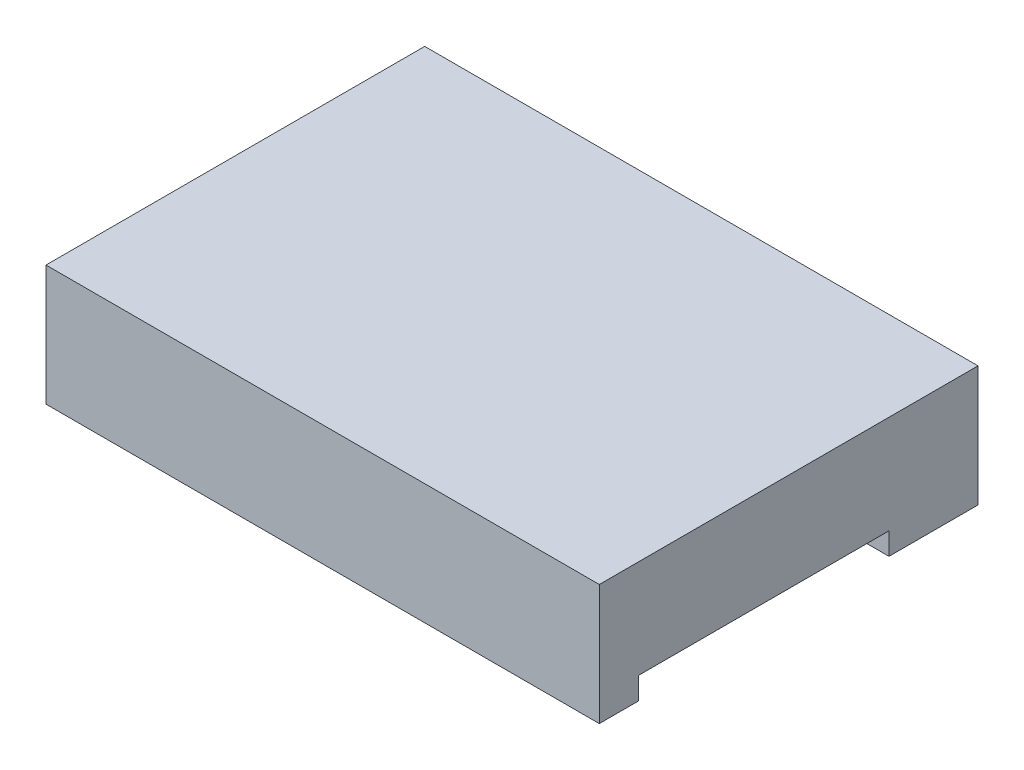
ISO-10303-21;
HEADER;
FILE_DESCRIPTION(('STEP AP214'),'2;1');
FILE_NAME('part.step','',(''),(''),'','','');
FILE_SCHEMA(('AUTOMOTIVE_DESIGN { 1 0 10303 214 1 1 1 1 }'));
ENDSEC;
DATA;
#1=APPLICATION_CONTEXT('core data for automotive mechanical design processes');
#2=APPLICATION_PROTOCOL_DEFINITION('international standard','automotive_design',2000,#1);
#3=PRODUCT_CONTEXT('',#1,'mechanical');
#4=PRODUCT('Part','Part','',(#3));
#5=PRODUCT_RELATED_PRODUCT_CATEGORY('part','',(#4));
#6=PRODUCT_DEFINITION_FORMATION('','',#4);
#7=PRODUCT_DEFINITION_CONTEXT('part definition',#1,'design');
#8=PRODUCT_DEFINITION('design','',#6,#7);
#9=PRODUCT_DEFINITION_SHAPE('','',#8);
#10=(LENGTH_UNIT() NAMED_UNIT(*) SI_UNIT(.MILLI.,.METRE.));
#11=(NAMED_UNIT(*) PLANE_ANGLE_UNIT() SI_UNIT($,.RADIAN.));
#12=(NAMED_UNIT(*) SI_UNIT($,.STERADIAN.) SOLID_ANGLE_UNIT());
#13=UNCERTAINTY_MEASURE_WITH_UNIT(LENGTH_MEASURE(1.E-05),#10,'distance_accuracy_value','');
#14=(GEOMETRIC_REPRESENTATION_CONTEXT(3) GLOBAL_UNCERTAINTY_ASSIGNED_CONTEXT((#13)) GLOBAL_UNIT_ASSIGNED_CONTEXT((#10,
#11,#12)) REPRESENTATION_CONTEXT('',''));
#15=CARTESIAN_POINT('',(0.,0.,0.));
#16=DIRECTION('',(0.,0.,1.));
#17=DIRECTION('',(1.,0.,0.));
#18=AXIS2_PLACEMENT_3D('',#15,#16,#17);
#19=CARTESIAN_POINT('',(0.,1.5,0.));
#20=DIRECTION('',(0.,-1.,0.));
#21=DIRECTION('',(0.,0.,-1.));
#22=AXIS2_PLACEMENT_3D('',#19,#20,#21);
#23=PLANE('',#22);
#24=DIRECTION('',(0.,0.,-1.));
#25=VECTOR('',#24,1.);
#26=CARTESIAN_POINT('',(43.5,1.5,30.5));
#27=LINE('',#26,#25);
#28=CARTESIAN_POINT('',(43.5,1.5,38.5));
#29=VERTEX_POINT('',#28);
#30=CARTESIAN_POINT('',(43.5,1.5,30.5));
#31=VERTEX_POINT('',#30);
#32=EDGE_CURVE('E124',#29,#31,#27,.T.);
#33=ORIENTED_EDGE('',*,*,#32,.F.);
#34=DIRECTION('',(1.,0.,0.));
#35=VECTOR('',#34,1.);
#36=CARTESIAN_POINT('',(41.5,1.5,38.5));
#37=LINE('',#36,#35);
#38=CARTESIAN_POINT('',(-69.,1.5,38.5));
#39=VERTEX_POINT('',#38);
#40=EDGE_CURVE('E11',#39,#29,#37,.T.);
#41=ORIENTED_EDGE('',*,*,#40,.F.);
#42=DIRECTION('',(0.,0.,1.));
#43=VECTOR('',#42,1.);
#44=CARTESIAN_POINT('',(-69.,1.5,38.5));
#45=LINE('',#44,#43);
#46=CARTESIAN_POINT('',(-69.,1.5,-38.5));
#47=VERTEX_POINT('',#46);
#48=EDGE_CURVE('E40',#47,#39,#45,.T.);
#49=ORIENTED_EDGE('',*,*,#48,.F.);
#50=DIRECTION('',(-1.,0.,0.));
#51=VECTOR('',#50,1.);
#52=CARTESIAN_POINT('',(41.5,1.5,-38.5));
#53=LINE('',#52,#51);
#54=CARTESIAN_POINT('',(43.5,1.5,-38.5));
#55=VERTEX_POINT('',#54);
#56=EDGE_CURVE('E54',#55,#47,#53,.T.);
#57=ORIENTED_EDGE('',*,*,#56,.F.);
#58=DIRECTION('',(0.,0.,-1.));
#59=VECTOR('',#58,1.);
#60=CARTESIAN_POINT('',(43.5,1.5,-38.5));
#61=LINE('',#60,#59);
#62=CARTESIAN_POINT('',(43.5,1.5,-20.4));
#63=VERTEX_POINT('',#62);
#64=EDGE_CURVE('E132',#63,#55,#61,.T.);
#65=ORIENTED_EDGE('',*,*,#64,.F.);
#66=DIRECTION('',(1.,0.,0.));
#67=VECTOR('',#66,1.);
#68=CARTESIAN_POINT('',(43.5,1.5,-20.4));
#69=LINE('',#68,#67);
#70=CARTESIAN_POINT('',(-44.,1.5,-20.4));
#71=VERTEX_POINT('',#70);
#72=EDGE_CURVE('E129',#71,#63,#69,.T.);
#73=ORIENTED_EDGE('',*,*,#72,.F.);
#74=DIRECTION('',(0.,0.,-1.));
#75=VECTOR('',#74,1.);
#76=CARTESIAN_POINT('',(-44.,1.5,-20.4));
#77=LINE('',#76,#75);
#78=CARTESIAN_POINT('',(-44.,1.5,30.5));
#79=VERTEX_POINT('',#78);
#80=EDGE_CURVE('E173',#79,#71,#77,.T.);
#81=ORIENTED_EDGE('',*,*,#80,.F.);
#82=DIRECTION('',(-1.,0.,0.));
#83=VECTOR('',#82,1.);
#84=CARTESIAN_POINT('',(-44.,1.5,30.5));
#85=LINE('',#84,#83);
#86=EDGE_CURVE('E146',#31,#79,#85,.T.);
#87=ORIENTED_EDGE('',*,*,#86,.F.);
#88=EDGE_LOOP('',(#33,#41,#49,#57,#65,#73,#81,#87));
#89=FACE_BOUND('',#88,.T.);
#90=ADVANCED_FACE('F32',(#89),#23,.T.);
#91=CARTESIAN_POINT('',(-69.,-20.,38.5));
#92=DIRECTION('',(1.,0.,0.));
#93=DIRECTION('',(0.,0.,-1.));
#94=AXIS2_PLACEMENT_3D('',#91,#92,#93);
#95=PLANE('',#94);
#96=DIRECTION('',(0.,1.,0.));
#97=VECTOR('',#96,1.);
#98=CARTESIAN_POINT('',(-69.,-20.,-38.5));
#99=LINE('',#98,#97);
#100=CARTESIAN_POINT('',(-69.,26.,-38.5));
#101=VERTEX_POINT('',#100);
#102=EDGE_CURVE('E102',#47,#101,#99,.T.);
#103=ORIENTED_EDGE('',*,*,#102,.F.);
#104=ORIENTED_EDGE('',*,*,#48,.T.);
#105=DIRECTION('',(0.,1.,0.));
#106=VECTOR('',#105,1.);
#107=CARTESIAN_POINT('',(-69.,-20.,38.5));
#108=LINE('',#107,#106);
#109=CARTESIAN_POINT('',(-69.,26.,38.5));
#110=VERTEX_POINT('',#109);
#111=EDGE_CURVE('E96',#39,#110,#108,.T.);
#112=ORIENTED_EDGE('',*,*,#111,.T.);
#113=DIRECTION('',(0.,0.,1.));
#114=VECTOR('',#113,1.);
#115=CARTESIAN_POINT('',(-69.,26.,-38.5));
#116=LINE('',#115,#114);
#117=EDGE_CURVE('E100',#101,#110,#116,.T.);
#118=ORIENTED_EDGE('',*,*,#117,.F.);
#119=EDGE_LOOP('',(#103,#104,#112,#118));
#120=FACE_BOUND('',#119,.T.);
#121=ADVANCED_FACE('F98',(#120),#95,.F.);
#122=CARTESIAN_POINT('',(0.,26.,0.));
#123=DIRECTION('',(0.,1.,0.));
#124=DIRECTION('',(0.,0.,1.));
#125=AXIS2_PLACEMENT_3D('',#122,#123,#124);
#126=PLANE('',#125);
#127=ORIENTED_EDGE('',*,*,#117,.T.);
#128=DIRECTION('',(1.,0.,0.));
#129=VECTOR('',#128,1.);
#130=CARTESIAN_POINT('',(-69.,26.,38.5));
#131=LINE('',#130,#129);
#132=CARTESIAN_POINT('',(43.5,26.,38.5));
#133=VERTEX_POINT('',#132);
#134=EDGE_CURVE('E105',#110,#133,#131,.T.);
#135=ORIENTED_EDGE('',*,*,#134,.T.);
#136=DIRECTION('',(0.,0.,-1.));
#137=VECTOR('',#136,1.);
#138=CARTESIAN_POINT('',(43.5,26.,-38.5));
#139=LINE('',#138,#137);
#140=CARTESIAN_POINT('',(43.5,26.,-38.5));
#141=VERTEX_POINT('',#140);
#142=EDGE_CURVE('E111',#133,#141,#139,.T.);
#143=ORIENTED_EDGE('',*,*,#142,.T.);
#144=DIRECTION('',(-1.,0.,0.));
#145=VECTOR('',#144,1.);
#146=CARTESIAN_POINT('',(-69.,26.,-38.5));
#147=LINE('',#146,#145);
#148=EDGE_CURVE('E116',#141,#101,#147,.T.);
#149=ORIENTED_EDGE('',*,*,#148,.T.);
#150=EDGE_LOOP('',(#127,#135,#143,#149));
#151=FACE_BOUND('',#150,.T.);
#152=ADVANCED_FACE('F114',(#151),#126,.T.);
#153=CARTESIAN_POINT('',(41.5,-20.,-38.5));
#154=DIRECTION('',(0.,0.,1.));
#155=DIRECTION('',(1.,0.,0.));
#156=AXIS2_PLACEMENT_3D('',#153,#154,#155);
#157=PLANE('',#156);
#158=DIRECTION('',(0.,1.,0.));
#159=VECTOR('',#158,1.);
#160=CARTESIAN_POINT('',(43.5,-20.,-38.5));
#161=LINE('',#160,#159);
#162=EDGE_CURVE('E185',#55,#141,#161,.T.);
#163=ORIENTED_EDGE('',*,*,#162,.F.);
#164=ORIENTED_EDGE('',*,*,#56,.T.);
#165=ORIENTED_EDGE('',*,*,#102,.T.);
#166=ORIENTED_EDGE('',*,*,#148,.F.);
#167=EDGE_LOOP('',(#163,#164,#165,#166));
#168=FACE_BOUND('',#167,.T.);
#169=ADVANCED_FACE('F215',(#168),#157,.F.);
#170=CARTESIAN_POINT('',(41.5,-20.,38.5));
#171=DIRECTION('',(0.,0.,-1.));
#172=DIRECTION('',(-1.,0.,0.));
#173=AXIS2_PLACEMENT_3D('',#170,#171,#172);
#174=PLANE('',#173);
#175=ORIENTED_EDGE('',*,*,#111,.F.);
#176=ORIENTED_EDGE('',*,*,#40,.T.);
#177=DIRECTION('',(0.,1.,0.));
#178=VECTOR('',#177,1.);
#179=CARTESIAN_POINT('',(43.5,-20.,38.5));
#180=LINE('',#179,#178);
#181=EDGE_CURVE('E107',#29,#133,#180,.T.);
#182=ORIENTED_EDGE('',*,*,#181,.T.);
#183=ORIENTED_EDGE('',*,*,#134,.F.);
#184=EDGE_LOOP('',(#175,#176,#182,#183));
#185=FACE_BOUND('',#184,.T.);
#186=ADVANCED_FACE('F34',(#185),#174,.F.);
#187=CARTESIAN_POINT('',(43.5,144.327730121205,-20.4));
#188=DIRECTION('',(0.,0.,-1.));
#189=DIRECTION('',(-1.,0.,0.));
#190=AXIS2_PLACEMENT_3D('',#187,#188,#189);
#191=PLANE('',#190);
#192=DIRECTION('',(1.,0.,0.));
#193=VECTOR('',#192,1.);
#194=CARTESIAN_POINT('',(43.5,6.00000000000001,-20.4));
#195=LINE('',#194,#193);
#196=CARTESIAN_POINT('',(-44.,6.00000000000001,-20.4));
#197=VERTEX_POINT('',#196);
#198=CARTESIAN_POINT('',(43.5,6.,-20.4));
#199=VERTEX_POINT('',#198);
#200=EDGE_CURVE('E151',#197,#199,#195,.T.);
#201=ORIENTED_EDGE('',*,*,#200,.F.);
#202=DIRECTION('',(0.,-1.,0.));
#203=VECTOR('',#202,1.);
#204=CARTESIAN_POINT('',(-44.,144.327730121205,-20.4));
#205=LINE('',#204,#203);
#206=EDGE_CURVE('E137',#197,#71,#205,.T.);
#207=ORIENTED_EDGE('',*,*,#206,.T.);
#208=ORIENTED_EDGE('',*,*,#72,.T.);
#209=DIRECTION('',(0.,-1.,0.));
#210=VECTOR('',#209,1.);
#211=CARTESIAN_POINT('',(43.5,144.327730121205,-20.4));
#212=LINE('',#211,#210);
#213=EDGE_CURVE('E136',#199,#63,#212,.T.);
#214=ORIENTED_EDGE('',*,*,#213,.F.);
#215=EDGE_LOOP('',(#201,#207,#208,#214));
#216=FACE_BOUND('',#215,.T.);
#217=ADVANCED_FACE('F181',(#216),#191,.F.);
#218=CARTESIAN_POINT('',(-44.,144.327730121205,-20.4));
#219=DIRECTION('',(-1.,0.,0.));
#220=DIRECTION('',(0.,0.,1.));
#221=AXIS2_PLACEMENT_3D('',#218,#219,#220);
#222=PLANE('',#221);
#223=DIRECTION('',(0.,0.,-1.));
#224=VECTOR('',#223,1.);
#225=CARTESIAN_POINT('',(-44.,6.00000000000001,-20.4));
#226=LINE('',#225,#224);
#227=CARTESIAN_POINT('',(-44.,6.00000000000001,30.5));
#228=VERTEX_POINT('',#227);
#229=EDGE_CURVE('E149',#228,#197,#226,.T.);
#230=ORIENTED_EDGE('',*,*,#229,.F.);
#231=DIRECTION('',(0.,-1.,0.));
#232=VECTOR('',#231,1.);
#233=CARTESIAN_POINT('',(-44.,144.327730121205,30.5));
#234=LINE('',#233,#232);
#235=EDGE_CURVE('E170',#228,#79,#234,.T.);
#236=ORIENTED_EDGE('',*,*,#235,.T.);
#237=ORIENTED_EDGE('',*,*,#80,.T.);
#238=ORIENTED_EDGE('',*,*,#206,.F.);
#239=EDGE_LOOP('',(#230,#236,#237,#238));
#240=FACE_BOUND('',#239,.T.);
#241=ADVANCED_FACE('F190',(#240),#222,.F.);
#242=CARTESIAN_POINT('',(43.5,-20.,-38.5));
#243=DIRECTION('',(-1.,0.,0.));
#244=DIRECTION('',(0.,0.,1.));
#245=AXIS2_PLACEMENT_3D('',#242,#243,#244);
#246=PLANE('',#245);
#247=ORIENTED_EDGE('',*,*,#181,.F.);
#248=ORIENTED_EDGE('',*,*,#32,.T.);
#249=DIRECTION('',(0.,-1.,0.));
#250=VECTOR('',#249,1.);
#251=CARTESIAN_POINT('',(43.5,144.327730121205,30.5));
#252=LINE('',#251,#250);
#253=CARTESIAN_POINT('',(43.5,6.00000000000001,30.5));
#254=VERTEX_POINT('',#253);
#255=EDGE_CURVE('E141',#254,#31,#252,.T.);
#256=ORIENTED_EDGE('',*,*,#255,.F.);
#257=DIRECTION('',(0.,0.,-1.));
#258=VECTOR('',#257,1.);
#259=CARTESIAN_POINT('',(43.5,6.,-38.5));
#260=LINE('',#259,#258);
#261=EDGE_CURVE('E117',#254,#199,#260,.T.);
#262=ORIENTED_EDGE('',*,*,#261,.T.);
#263=ORIENTED_EDGE('',*,*,#213,.T.);
#264=ORIENTED_EDGE('',*,*,#64,.T.);
#265=ORIENTED_EDGE('',*,*,#162,.T.);
#266=ORIENTED_EDGE('',*,*,#142,.F.);
#267=EDGE_LOOP('',(#247,#248,#256,#262,#263,#264,#265,#266));
#268=FACE_BOUND('',#267,.T.);
#269=ADVANCED_FACE('F184',(#268),#246,.F.);
#270=CARTESIAN_POINT('',(0.,6.,0.));
#271=DIRECTION('',(0.,1.,0.));
#272=DIRECTION('',(0.,0.,1.));
#273=AXIS2_PLACEMENT_3D('',#270,#271,#272);
#274=PLANE('',#273);
#275=ORIENTED_EDGE('',*,*,#261,.F.);
#276=DIRECTION('',(-1.,0.,0.));
#277=VECTOR('',#276,1.);
#278=CARTESIAN_POINT('',(-44.,6.00000000000001,30.5));
#279=LINE('',#278,#277);
#280=EDGE_CURVE('E135',#254,#228,#279,.T.);
#281=ORIENTED_EDGE('',*,*,#280,.T.);
#282=ORIENTED_EDGE('',*,*,#229,.T.);
#283=ORIENTED_EDGE('',*,*,#200,.T.);
#284=EDGE_LOOP('',(#275,#281,#282,#283));
#285=FACE_BOUND('',#284,.T.);
#286=ADVANCED_FACE('F188',(#285),#274,.F.);
#287=CARTESIAN_POINT('',(-44.,144.327730121205,30.5));
#288=DIRECTION('',(0.,0.,1.));
#289=DIRECTION('',(1.,0.,0.));
#290=AXIS2_PLACEMENT_3D('',#287,#288,#289);
#291=PLANE('',#290);
#292=ORIENTED_EDGE('',*,*,#280,.F.);
#293=ORIENTED_EDGE('',*,*,#255,.T.);
#294=ORIENTED_EDGE('',*,*,#86,.T.);
#295=ORIENTED_EDGE('',*,*,#235,.F.);
#296=EDGE_LOOP('',(#292,#293,#294,#295));
#297=FACE_BOUND('',#296,.T.);
#298=ADVANCED_FACE('F191',(#297),#291,.F.);
#299=CLOSED_SHELL('',(#90,#121,#152,#169,#186,#217,#241,#269,#286,#298));
#300=MANIFOLD_SOLID_BREP('B2',#299);
#301=ADVANCED_BREP_SHAPE_REPRESENTATION('',(#18,#300),#14);
#302=SHAPE_DEFINITION_REPRESENTATION(#9,#301);
ENDSEC;
END-ISO-10303-21;
